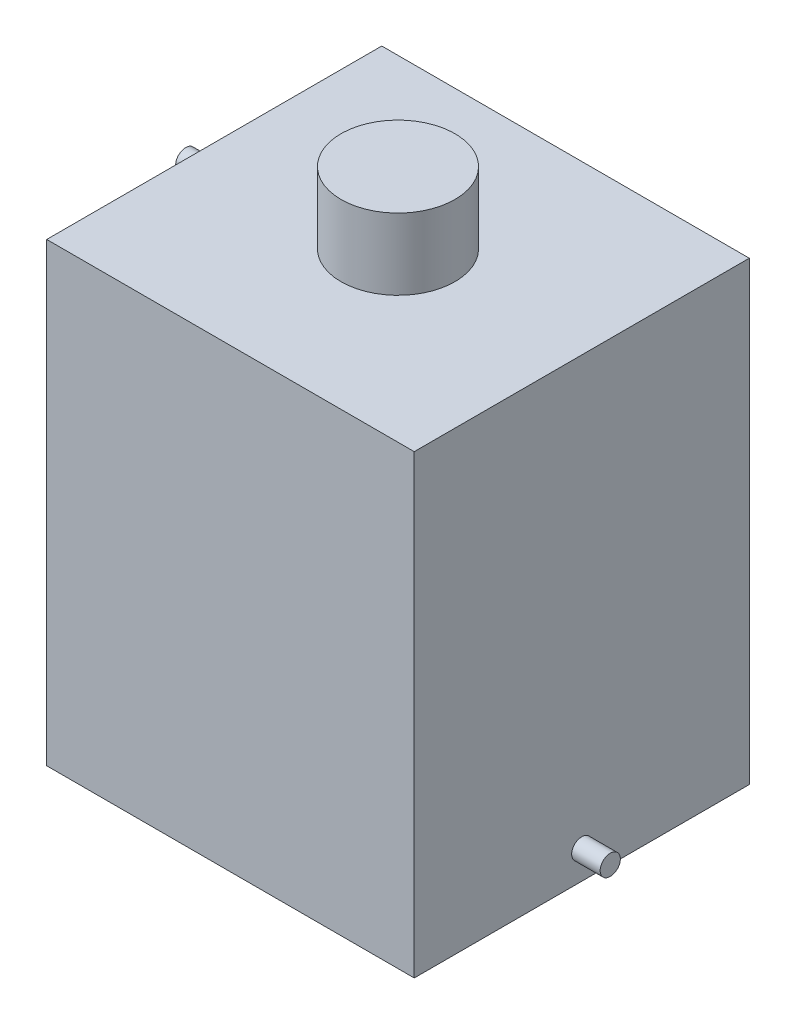
ISO-10303-21;
HEADER;
FILE_DESCRIPTION(('STEP AP214'),'2;1');
FILE_NAME('part.step','',(''),(''),'','','');
FILE_SCHEMA(('AUTOMOTIVE_DESIGN { 1 0 10303 214 1 1 1 1 }'));
ENDSEC;
DATA;
#1=APPLICATION_CONTEXT('core data for automotive mechanical design processes');
#2=APPLICATION_PROTOCOL_DEFINITION('international standard','automotive_design',2000,#1);
#3=PRODUCT_CONTEXT('',#1,'mechanical');
#4=PRODUCT('Part','Part','',(#3));
#5=PRODUCT_RELATED_PRODUCT_CATEGORY('part','',(#4));
#6=PRODUCT_DEFINITION_FORMATION('','',#4);
#7=PRODUCT_DEFINITION_CONTEXT('part definition',#1,'design');
#8=PRODUCT_DEFINITION('design','',#6,#7);
#9=PRODUCT_DEFINITION_SHAPE('','',#8);
#10=(LENGTH_UNIT() NAMED_UNIT(*) SI_UNIT(.MILLI.,.METRE.));
#11=(NAMED_UNIT(*) PLANE_ANGLE_UNIT() SI_UNIT($,.RADIAN.));
#12=(NAMED_UNIT(*) SI_UNIT($,.STERADIAN.) SOLID_ANGLE_UNIT());
#13=UNCERTAINTY_MEASURE_WITH_UNIT(LENGTH_MEASURE(1.E-05),#10,'distance_accuracy_value','');
#14=(GEOMETRIC_REPRESENTATION_CONTEXT(3) GLOBAL_UNCERTAINTY_ASSIGNED_CONTEXT((#13)) GLOBAL_UNIT_ASSIGNED_CONTEXT((#10,
#11,#12)) REPRESENTATION_CONTEXT('',''));
#15=CARTESIAN_POINT('',(0.,0.,0.));
#16=DIRECTION('',(0.,0.,1.));
#17=DIRECTION('',(1.,0.,0.));
#18=AXIS2_PLACEMENT_3D('',#15,#16,#17);
#19=CARTESIAN_POINT('',(-81.915,203.2,-74.676));
#20=DIRECTION('',(1.,0.,0.));
#21=DIRECTION('',(0.,0.,-1.));
#22=AXIS2_PLACEMENT_3D('',#19,#20,#21);
#23=PLANE('',#22);
#24=CARTESIAN_POINT('',(-81.915,190.5,0.));
#25=DIRECTION('',(1.,0.,0.));
#26=DIRECTION('',(0.,0.,-1.));
#27=AXIS2_PLACEMENT_3D('',#24,#25,#26);
#28=CIRCLE('',#27,4.5);
#29=CARTESIAN_POINT('',(-81.915,190.5,-4.49999999999999));
#30=VERTEX_POINT('',#29);
#31=EDGE_CURVE('E49',#30,#30,#28,.F.);
#32=ORIENTED_EDGE('',*,*,#31,.F.);
#33=EDGE_LOOP('',(#32));
#34=FACE_BOUND('',#33,.T.);
#35=DIRECTION('',(0.,0.,1.));
#36=VECTOR('',#35,1.);
#37=CARTESIAN_POINT('',(-81.915,0.,-74.676));
#38=LINE('',#37,#36);
#39=CARTESIAN_POINT('',(-81.915,0.,-74.676));
#40=VERTEX_POINT('',#39);
#41=CARTESIAN_POINT('',(-81.915,0.,74.676));
#42=VERTEX_POINT('',#41);
#43=EDGE_CURVE('E108',#40,#42,#38,.T.);
#44=ORIENTED_EDGE('',*,*,#43,.T.);
#45=DIRECTION('',(0.,-1.,0.));
#46=VECTOR('',#45,1.);
#47=CARTESIAN_POINT('',(-81.915,203.2,74.676));
#48=LINE('',#47,#46);
#49=CARTESIAN_POINT('',(-81.915,203.2,74.676));
#50=VERTEX_POINT('',#49);
#51=EDGE_CURVE('E99',#50,#42,#48,.T.);
#52=ORIENTED_EDGE('',*,*,#51,.F.);
#53=DIRECTION('',(0.,0.,1.));
#54=VECTOR('',#53,1.);
#55=CARTESIAN_POINT('',(-81.915,203.2,-74.676));
#56=LINE('',#55,#54);
#57=CARTESIAN_POINT('',(-81.915,203.2,-74.676));
#58=VERTEX_POINT('',#57);
#59=EDGE_CURVE('E93',#58,#50,#56,.T.);
#60=ORIENTED_EDGE('',*,*,#59,.F.);
#61=DIRECTION('',(0.,-1.,0.));
#62=VECTOR('',#61,1.);
#63=CARTESIAN_POINT('',(-81.915,203.2,-74.676));
#64=LINE('',#63,#62);
#65=EDGE_CURVE('E104',#58,#40,#64,.T.);
#66=ORIENTED_EDGE('',*,*,#65,.T.);
#67=EDGE_LOOP('',(#44,#52,#60,#66));
#68=FACE_BOUND('',#67,.T.);
#69=ADVANCED_FACE('F41',(#34,#68),#23,.F.);
#70=CARTESIAN_POINT('',(81.915,203.2,74.676));
#71=DIRECTION('',(0.,0.,-1.));
#72=DIRECTION('',(-1.,0.,0.));
#73=AXIS2_PLACEMENT_3D('',#70,#71,#72);
#74=PLANE('',#73);
#75=DIRECTION('',(1.,0.,0.));
#76=VECTOR('',#75,1.);
#77=CARTESIAN_POINT('',(81.915,0.,74.676));
#78=LINE('',#77,#76);
#79=CARTESIAN_POINT('',(81.915,0.,74.676));
#80=VERTEX_POINT('',#79);
#81=EDGE_CURVE('E98',#42,#80,#78,.T.);
#82=ORIENTED_EDGE('',*,*,#81,.T.);
#83=DIRECTION('',(0.,-1.,0.));
#84=VECTOR('',#83,1.);
#85=CARTESIAN_POINT('',(81.915,203.2,74.676));
#86=LINE('',#85,#84);
#87=CARTESIAN_POINT('',(81.915,203.2,74.676));
#88=VERTEX_POINT('',#87);
#89=EDGE_CURVE('E96',#88,#80,#86,.T.);
#90=ORIENTED_EDGE('',*,*,#89,.F.);
#91=DIRECTION('',(1.,0.,0.));
#92=VECTOR('',#91,1.);
#93=CARTESIAN_POINT('',(81.915,203.2,74.676));
#94=LINE('',#93,#92);
#95=EDGE_CURVE('E88',#50,#88,#94,.T.);
#96=ORIENTED_EDGE('',*,*,#95,.F.);
#97=ORIENTED_EDGE('',*,*,#51,.T.);
#98=EDGE_LOOP('',(#82,#90,#96,#97));
#99=FACE_BOUND('',#98,.T.);
#100=ADVANCED_FACE('F97',(#99),#74,.F.);
#101=CARTESIAN_POINT('',(81.915,203.2,-74.676));
#102=DIRECTION('',(-1.,0.,0.));
#103=DIRECTION('',(0.,0.,1.));
#104=AXIS2_PLACEMENT_3D('',#101,#102,#103);
#105=PLANE('',#104);
#106=CARTESIAN_POINT('',(81.915,12.7,0.));
#107=DIRECTION('',(-1.,0.,0.));
#108=DIRECTION('',(0.,0.,1.));
#109=AXIS2_PLACEMENT_3D('',#106,#107,#108);
#110=CIRCLE('',#109,4.5);
#111=CARTESIAN_POINT('',(81.915,12.7,4.5));
#112=VERTEX_POINT('',#111);
#113=EDGE_CURVE('E11',#112,#112,#110,.F.);
#114=ORIENTED_EDGE('',*,*,#113,.F.);
#115=EDGE_LOOP('',(#114));
#116=FACE_BOUND('',#115,.T.);
#117=DIRECTION('',(0.,0.,-1.));
#118=VECTOR('',#117,1.);
#119=CARTESIAN_POINT('',(81.915,0.,-74.676));
#120=LINE('',#119,#118);
#121=CARTESIAN_POINT('',(81.915,0.,-74.676));
#122=VERTEX_POINT('',#121);
#123=EDGE_CURVE('E74',#80,#122,#120,.T.);
#124=ORIENTED_EDGE('',*,*,#123,.T.);
#125=DIRECTION('',(0.,-1.,0.));
#126=VECTOR('',#125,1.);
#127=CARTESIAN_POINT('',(81.915,203.2,-74.676));
#128=LINE('',#127,#126);
#129=CARTESIAN_POINT('',(81.915,203.2,-74.676));
#130=VERTEX_POINT('',#129);
#131=EDGE_CURVE('E100',#130,#122,#128,.T.);
#132=ORIENTED_EDGE('',*,*,#131,.F.);
#133=DIRECTION('',(0.,0.,-1.));
#134=VECTOR('',#133,1.);
#135=CARTESIAN_POINT('',(81.915,203.2,-74.676));
#136=LINE('',#135,#134);
#137=EDGE_CURVE('E91',#88,#130,#136,.T.);
#138=ORIENTED_EDGE('',*,*,#137,.F.);
#139=ORIENTED_EDGE('',*,*,#89,.T.);
#140=EDGE_LOOP('',(#124,#132,#138,#139));
#141=FACE_BOUND('',#140,.T.);
#142=ADVANCED_FACE('F102',(#116,#141),#105,.F.);
#143=CARTESIAN_POINT('',(81.915,203.2,-74.676));
#144=DIRECTION('',(0.,0.,1.));
#145=DIRECTION('',(1.,0.,0.));
#146=AXIS2_PLACEMENT_3D('',#143,#144,#145);
#147=PLANE('',#146);
#148=DIRECTION('',(-1.,0.,0.));
#149=VECTOR('',#148,1.);
#150=CARTESIAN_POINT('',(81.915,0.,-74.676));
#151=LINE('',#150,#149);
#152=EDGE_CURVE('E80',#122,#40,#151,.T.);
#153=ORIENTED_EDGE('',*,*,#152,.T.);
#154=ORIENTED_EDGE('',*,*,#65,.F.);
#155=DIRECTION('',(-1.,0.,0.));
#156=VECTOR('',#155,1.);
#157=CARTESIAN_POINT('',(81.915,203.2,-74.676));
#158=LINE('',#157,#156);
#159=EDGE_CURVE('E57',#130,#58,#158,.T.);
#160=ORIENTED_EDGE('',*,*,#159,.F.);
#161=ORIENTED_EDGE('',*,*,#131,.T.);
#162=EDGE_LOOP('',(#153,#154,#160,#161));
#163=FACE_BOUND('',#162,.T.);
#164=ADVANCED_FACE('F145',(#163),#147,.F.);
#165=CARTESIAN_POINT('',(0.,203.2,0.));
#166=DIRECTION('',(0.,-1.,0.));
#167=DIRECTION('',(0.,0.,-1.));
#168=AXIS2_PLACEMENT_3D('',#165,#166,#167);
#169=PLANE('',#168);
#170=CARTESIAN_POINT('',(0.,203.2,0.));
#171=DIRECTION('',(0.,1.,0.));
#172=DIRECTION('',(0.,0.,1.));
#173=AXIS2_PLACEMENT_3D('',#170,#171,#172);
#174=CIRCLE('',#173,25.4);
#175=CARTESIAN_POINT('',(0.,203.2,25.4));
#176=VERTEX_POINT('',#175);
#177=EDGE_CURVE('E117',#176,#176,#174,.T.);
#178=ORIENTED_EDGE('',*,*,#177,.F.);
#179=EDGE_LOOP('',(#178));
#180=FACE_BOUND('',#179,.T.);
#181=ORIENTED_EDGE('',*,*,#59,.T.);
#182=ORIENTED_EDGE('',*,*,#95,.T.);
#183=ORIENTED_EDGE('',*,*,#137,.T.);
#184=ORIENTED_EDGE('',*,*,#159,.T.);
#185=EDGE_LOOP('',(#181,#182,#183,#184));
#186=FACE_BOUND('',#185,.T.);
#187=ADVANCED_FACE('F89',(#180,#186),#169,.F.);
#188=CARTESIAN_POINT('',(0.,0.,0.));
#189=DIRECTION('',(0.,-1.,0.));
#190=DIRECTION('',(0.,0.,-1.));
#191=AXIS2_PLACEMENT_3D('',#188,#189,#190);
#192=PLANE('',#191);
#193=ORIENTED_EDGE('',*,*,#43,.F.);
#194=ORIENTED_EDGE('',*,*,#152,.F.);
#195=ORIENTED_EDGE('',*,*,#123,.F.);
#196=ORIENTED_EDGE('',*,*,#81,.F.);
#197=EDGE_LOOP('',(#193,#194,#195,#196));
#198=FACE_BOUND('',#197,.T.);
#199=ADVANCED_FACE('F159',(#198),#192,.T.);
#200=CARTESIAN_POINT('',(0.,234.95,0.));
#201=DIRECTION('',(0.,-1.,0.));
#202=DIRECTION('',(0.,0.,-1.));
#203=AXIS2_PLACEMENT_3D('',#200,#201,#202);
#204=CYLINDRICAL_SURFACE('',#203,25.4);
#205=CARTESIAN_POINT('',(0.,234.95,0.));
#206=DIRECTION('',(0.,1.,0.));
#207=DIRECTION('',(0.,0.,1.));
#208=AXIS2_PLACEMENT_3D('',#205,#206,#207);
#209=CIRCLE('',#208,25.4);
#210=CARTESIAN_POINT('',(0.,234.95,25.4));
#211=VERTEX_POINT('',#210);
#212=EDGE_CURVE('E111',#211,#211,#209,.T.);
#213=ORIENTED_EDGE('',*,*,#212,.F.);
#214=EDGE_LOOP('',(#213));
#215=FACE_BOUND('',#214,.T.);
#216=ORIENTED_EDGE('',*,*,#177,.T.);
#217=EDGE_LOOP('',(#216));
#218=FACE_BOUND('',#217,.T.);
#219=ADVANCED_FACE('F161',(#215,#218),#204,.T.);
#220=CARTESIAN_POINT('',(0.,234.95,0.));
#221=DIRECTION('',(0.,1.,0.));
#222=DIRECTION('',(0.,0.,1.));
#223=AXIS2_PLACEMENT_3D('',#220,#221,#222);
#224=PLANE('',#223);
#225=ORIENTED_EDGE('',*,*,#212,.T.);
#226=EDGE_LOOP('',(#225));
#227=FACE_BOUND('',#226,.T.);
#228=ADVANCED_FACE('F167',(#227),#224,.T.);
#229=CARTESIAN_POINT('',(-94.615,190.5,0.));
#230=DIRECTION('',(1.,0.,0.));
#231=DIRECTION('',(0.,0.,-1.));
#232=AXIS2_PLACEMENT_3D('',#229,#230,#231);
#233=CYLINDRICAL_SURFACE('',#232,4.5);
#234=CARTESIAN_POINT('',(-94.615,190.5,0.));
#235=DIRECTION('',(-1.,0.,0.));
#236=DIRECTION('',(0.,0.,1.));
#237=AXIS2_PLACEMENT_3D('',#234,#235,#236);
#238=CIRCLE('',#237,4.5);
#239=CARTESIAN_POINT('',(-94.615,190.5,4.50000000000001));
#240=VERTEX_POINT('',#239);
#241=EDGE_CURVE('E128',#240,#240,#238,.T.);
#242=ORIENTED_EDGE('',*,*,#241,.F.);
#243=EDGE_LOOP('',(#242));
#244=FACE_BOUND('',#243,.T.);
#245=ORIENTED_EDGE('',*,*,#31,.T.);
#246=EDGE_LOOP('',(#245));
#247=FACE_BOUND('',#246,.T.);
#248=ADVANCED_FACE('F175',(#244,#247),#233,.T.);
#249=CARTESIAN_POINT('',(-94.615,190.5,0.));
#250=DIRECTION('',(-1.,0.,0.));
#251=DIRECTION('',(0.,0.,1.));
#252=AXIS2_PLACEMENT_3D('',#249,#250,#251);
#253=PLANE('',#252);
#254=ORIENTED_EDGE('',*,*,#241,.T.);
#255=EDGE_LOOP('',(#254));
#256=FACE_BOUND('',#255,.T.);
#257=ADVANCED_FACE('F140',(#256),#253,.T.);
#258=CARTESIAN_POINT('',(94.615,12.7,0.));
#259=DIRECTION('',(-1.,0.,0.));
#260=DIRECTION('',(0.,0.,1.));
#261=AXIS2_PLACEMENT_3D('',#258,#259,#260);
#262=CYLINDRICAL_SURFACE('',#261,4.5);
#263=CARTESIAN_POINT('',(94.615,12.7,0.));
#264=DIRECTION('',(1.,0.,0.));
#265=DIRECTION('',(0.,0.,-1.));
#266=AXIS2_PLACEMENT_3D('',#263,#264,#265);
#267=CIRCLE('',#266,4.5);
#268=CARTESIAN_POINT('',(94.615,12.7,-4.5));
#269=VERTEX_POINT('',#268);
#270=EDGE_CURVE('E131',#269,#269,#267,.T.);
#271=ORIENTED_EDGE('',*,*,#270,.F.);
#272=EDGE_LOOP('',(#271));
#273=FACE_BOUND('',#272,.T.);
#274=ORIENTED_EDGE('',*,*,#113,.T.);
#275=EDGE_LOOP('',(#274));
#276=FACE_BOUND('',#275,.T.);
#277=ADVANCED_FACE('F137',(#273,#276),#262,.T.);
#278=CARTESIAN_POINT('',(94.615,12.7,0.));
#279=DIRECTION('',(1.,0.,0.));
#280=DIRECTION('',(0.,0.,-1.));
#281=AXIS2_PLACEMENT_3D('',#278,#279,#280);
#282=PLANE('',#281);
#283=ORIENTED_EDGE('',*,*,#270,.T.);
#284=EDGE_LOOP('',(#283));
#285=FACE_BOUND('',#284,.T.);
#286=ADVANCED_FACE('F135',(#285),#282,.T.);
#287=CLOSED_SHELL('',(#69,#100,#142,#164,#187,#199,#219,#228,#248,#257,#277,#286));
#288=MANIFOLD_SOLID_BREP('B2',#287);
#289=ADVANCED_BREP_SHAPE_REPRESENTATION('',(#18,#288),#14);
#290=SHAPE_DEFINITION_REPRESENTATION(#9,#289);
ENDSEC;
END-ISO-10303-21;
